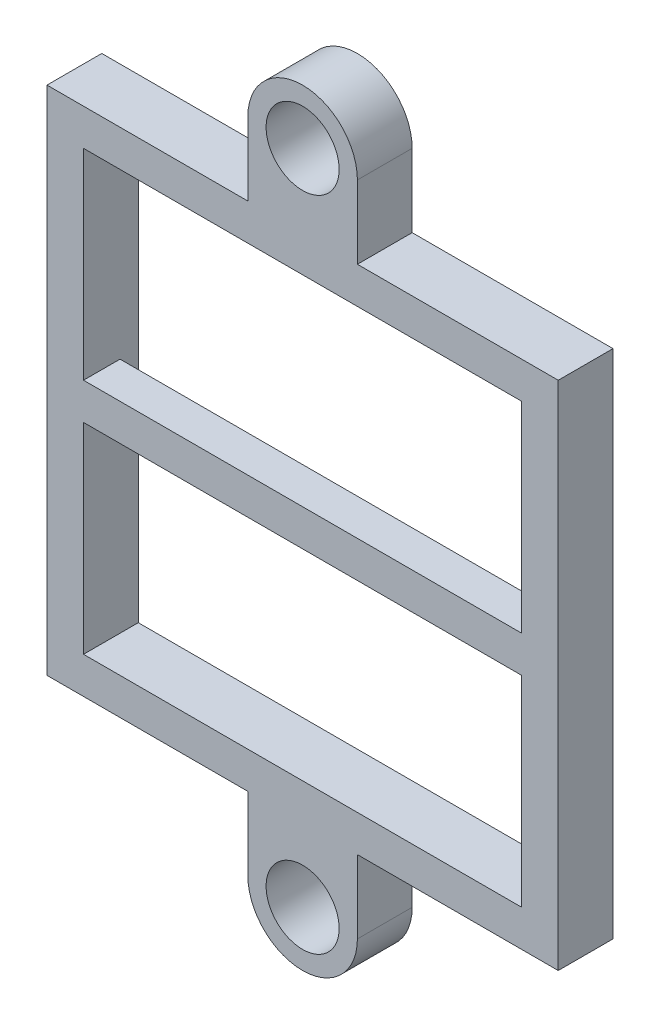
ISO-10303-21;
HEADER;
FILE_DESCRIPTION(('STEP AP214'),'2;1');
FILE_NAME('part.step','',(''),(''),'','','');
FILE_SCHEMA(('AUTOMOTIVE_DESIGN { 1 0 10303 214 1 1 1 1 }'));
ENDSEC;
DATA;
#1=APPLICATION_CONTEXT('core data for automotive mechanical design processes');
#2=APPLICATION_PROTOCOL_DEFINITION('international standard','automotive_design',2000,#1);
#3=PRODUCT_CONTEXT('',#1,'mechanical');
#4=PRODUCT('Part','Part','',(#3));
#5=PRODUCT_RELATED_PRODUCT_CATEGORY('part','',(#4));
#6=PRODUCT_DEFINITION_FORMATION('','',#4);
#7=PRODUCT_DEFINITION_CONTEXT('part definition',#1,'design');
#8=PRODUCT_DEFINITION('design','',#6,#7);
#9=PRODUCT_DEFINITION_SHAPE('','',#8);
#10=(LENGTH_UNIT() NAMED_UNIT(*) SI_UNIT(.MILLI.,.METRE.));
#11=(NAMED_UNIT(*) PLANE_ANGLE_UNIT() SI_UNIT($,.RADIAN.));
#12=(NAMED_UNIT(*) SI_UNIT($,.STERADIAN.) SOLID_ANGLE_UNIT());
#13=UNCERTAINTY_MEASURE_WITH_UNIT(LENGTH_MEASURE(1.E-05),#10,'distance_accuracy_value','');
#14=(GEOMETRIC_REPRESENTATION_CONTEXT(3) GLOBAL_UNCERTAINTY_ASSIGNED_CONTEXT((#13)) GLOBAL_UNIT_ASSIGNED_CONTEXT((#10,
#11,#12)) REPRESENTATION_CONTEXT('',''));
#15=CARTESIAN_POINT('',(0.,0.,0.));
#16=DIRECTION('',(0.,0.,1.));
#17=DIRECTION('',(1.,0.,0.));
#18=AXIS2_PLACEMENT_3D('',#15,#16,#17);
#19=CARTESIAN_POINT('',(-1.5,10.5,0.));
#20=DIRECTION('',(-1.,0.,0.));
#21=DIRECTION('',(0.,0.,1.));
#22=AXIS2_PLACEMENT_3D('',#19,#20,#21);
#23=PLANE('',#22);
#24=DIRECTION('',(0.,-1.,0.));
#25=VECTOR('',#24,1.);
#26=CARTESIAN_POINT('',(-1.5,10.5,1.5));
#27=LINE('',#26,#25);
#28=CARTESIAN_POINT('',(-1.5,9.,1.5));
#29=VERTEX_POINT('',#28);
#30=CARTESIAN_POINT('',(-1.5,7.,1.5));
#31=VERTEX_POINT('',#30);
#32=EDGE_CURVE('E262',#29,#31,#27,.T.);
#33=ORIENTED_EDGE('',*,*,#32,.F.);
#34=DIRECTION('',(0.,0.,1.));
#35=VECTOR('',#34,1.);
#36=CARTESIAN_POINT('',(-1.5,9.,-2.5));
#37=LINE('',#36,#35);
#38=CARTESIAN_POINT('',(-1.5,9.,0.));
#39=VERTEX_POINT('',#38);
#40=EDGE_CURVE('E250',#39,#29,#37,.T.);
#41=ORIENTED_EDGE('',*,*,#40,.F.);
#42=DIRECTION('',(0.,-1.,0.));
#43=VECTOR('',#42,1.);
#44=CARTESIAN_POINT('',(-1.5,10.5,0.));
#45=LINE('',#44,#43);
#46=CARTESIAN_POINT('',(-1.5,7.,0.));
#47=VERTEX_POINT('',#46);
#48=EDGE_CURVE('E264',#39,#47,#45,.T.);
#49=ORIENTED_EDGE('',*,*,#48,.T.);
#50=DIRECTION('',(0.,0.,-1.));
#51=VECTOR('',#50,1.);
#52=CARTESIAN_POINT('',(-1.5,7.,0.));
#53=LINE('',#52,#51);
#54=EDGE_CURVE('E257',#31,#47,#53,.T.);
#55=ORIENTED_EDGE('',*,*,#54,.F.);
#56=EDGE_LOOP('',(#33,#41,#49,#55));
#57=FACE_BOUND('',#56,.T.);
#58=ADVANCED_FACE('F71',(#57),#23,.T.);
#59=CARTESIAN_POINT('',(-7.,7.,1.5));
#60=DIRECTION('',(0.,-1.,0.));
#61=DIRECTION('',(1.,0.,0.));
#62=AXIS2_PLACEMENT_3D('',#59,#60,#61);
#63=PLANE('',#62);
#64=DIRECTION('',(-1.,0.,0.));
#65=VECTOR('',#64,1.);
#66=CARTESIAN_POINT('',(-7.,7.,0.));
#67=LINE('',#66,#65);
#68=CARTESIAN_POINT('',(7.,7.,0.));
#69=VERTEX_POINT('',#68);
#70=CARTESIAN_POINT('',(1.5,7.,0.));
#71=VERTEX_POINT('',#70);
#72=EDGE_CURVE('E326',#69,#71,#67,.T.);
#73=ORIENTED_EDGE('',*,*,#72,.T.);
#74=DIRECTION('',(0.,0.,1.));
#75=VECTOR('',#74,1.);
#76=CARTESIAN_POINT('',(1.5,7.,0.));
#77=LINE('',#76,#75);
#78=CARTESIAN_POINT('',(1.5,7.,1.5));
#79=VERTEX_POINT('',#78);
#80=EDGE_CURVE('E254',#71,#79,#77,.T.);
#81=ORIENTED_EDGE('',*,*,#80,.T.);
#82=DIRECTION('',(-1.,0.,0.));
#83=VECTOR('',#82,1.);
#84=CARTESIAN_POINT('',(-7.,7.,1.5));
#85=LINE('',#84,#83);
#86=CARTESIAN_POINT('',(7.,7.,1.5));
#87=VERTEX_POINT('',#86);
#88=EDGE_CURVE('E333',#87,#79,#85,.T.);
#89=ORIENTED_EDGE('',*,*,#88,.F.);
#90=DIRECTION('',(0.,0.,-1.));
#91=VECTOR('',#90,1.);
#92=CARTESIAN_POINT('',(7.,7.,1.5));
#93=LINE('',#92,#91);
#94=EDGE_CURVE('E350',#87,#69,#93,.T.);
#95=ORIENTED_EDGE('',*,*,#94,.T.);
#96=EDGE_LOOP('',(#73,#81,#89,#95));
#97=FACE_BOUND('',#96,.T.);
#98=ADVANCED_FACE('F405',(#97),#63,.F.);
#99=CARTESIAN_POINT('',(0.,0.,1.5));
#100=DIRECTION('',(0.,0.,-1.));
#101=DIRECTION('',(-1.,0.,0.));
#102=AXIS2_PLACEMENT_3D('',#99,#100,#101);
#103=PLANE('',#102);
#104=DIRECTION('',(0.,1.,0.));
#105=VECTOR('',#104,1.);
#106=CARTESIAN_POINT('',(6.,-6.,1.5));
#107=LINE('',#106,#105);
#108=CARTESIAN_POINT('',(6.,0.5,1.5));
#109=VERTEX_POINT('',#108);
#110=CARTESIAN_POINT('',(6.,6.,1.5));
#111=VERTEX_POINT('',#110);
#112=EDGE_CURVE('E297',#109,#111,#107,.T.);
#113=ORIENTED_EDGE('',*,*,#112,.F.);
#114=DIRECTION('',(-1.,0.,0.));
#115=VECTOR('',#114,1.);
#116=CARTESIAN_POINT('',(6.,0.5,1.5));
#117=LINE('',#116,#115);
#118=CARTESIAN_POINT('',(-6.,0.5,1.5));
#119=VERTEX_POINT('',#118);
#120=EDGE_CURVE('E232',#109,#119,#117,.T.);
#121=ORIENTED_EDGE('',*,*,#120,.T.);
#122=DIRECTION('',(0.,-1.,0.));
#123=VECTOR('',#122,1.);
#124=CARTESIAN_POINT('',(-6.,-6.,1.5));
#125=LINE('',#124,#123);
#126=CARTESIAN_POINT('',(-6.,6.,1.5));
#127=VERTEX_POINT('',#126);
#128=EDGE_CURVE('E218',#127,#119,#125,.T.);
#129=ORIENTED_EDGE('',*,*,#128,.F.);
#130=DIRECTION('',(-1.,0.,0.));
#131=VECTOR('',#130,1.);
#132=CARTESIAN_POINT('',(-6.,6.,1.5));
#133=LINE('',#132,#131);
#134=EDGE_CURVE('E219',#111,#127,#133,.T.);
#135=ORIENTED_EDGE('',*,*,#134,.F.);
#136=EDGE_LOOP('',(#113,#121,#129,#135));
#137=FACE_BOUND('',#136,.T.);
#138=CARTESIAN_POINT('',(0.,9.,1.5));
#139=DIRECTION('',(0.,0.,-1.));
#140=DIRECTION('',(1.,0.,0.));
#141=AXIS2_PLACEMENT_3D('',#138,#139,#140);
#142=CIRCLE('',#141,1.);
#143=CARTESIAN_POINT('',(1.,9.,1.5));
#144=VERTEX_POINT('',#143);
#145=EDGE_CURVE('E242',#144,#144,#142,.T.);
#146=ORIENTED_EDGE('',*,*,#145,.T.);
#147=EDGE_LOOP('',(#146));
#148=FACE_BOUND('',#147,.T.);
#149=CARTESIAN_POINT('',(0.,-9.,1.5));
#150=DIRECTION('',(0.,0.,1.));
#151=DIRECTION('',(1.,0.,0.));
#152=AXIS2_PLACEMENT_3D('',#149,#150,#151);
#153=CIRCLE('',#152,1.);
#154=CARTESIAN_POINT('',(1.,-9.,1.5));
#155=VERTEX_POINT('',#154);
#156=EDGE_CURVE('E268',#155,#155,#153,.T.);
#157=ORIENTED_EDGE('',*,*,#156,.F.);
#158=EDGE_LOOP('',(#157));
#159=FACE_BOUND('',#158,.T.);
#160=CARTESIAN_POINT('',(6.,-6.,1.5));
#161=VERTEX_POINT('',#160);
#162=CARTESIAN_POINT('',(6.,-0.5,1.5));
#163=VERTEX_POINT('',#162);
#164=EDGE_CURVE('E295',#161,#163,#107,.T.);
#165=ORIENTED_EDGE('',*,*,#164,.F.);
#166=DIRECTION('',(1.,0.,0.));
#167=VECTOR('',#166,1.);
#168=CARTESIAN_POINT('',(-6.,-6.,1.5));
#169=LINE('',#168,#167);
#170=CARTESIAN_POINT('',(-6.,-6.,1.5));
#171=VERTEX_POINT('',#170);
#172=EDGE_CURVE('E215',#171,#161,#169,.T.);
#173=ORIENTED_EDGE('',*,*,#172,.F.);
#174=CARTESIAN_POINT('',(-6.,-0.5,1.5));
#175=VERTEX_POINT('',#174);
#176=EDGE_CURVE('E208',#175,#171,#125,.T.);
#177=ORIENTED_EDGE('',*,*,#176,.F.);
#178=DIRECTION('',(1.,0.,0.));
#179=VECTOR('',#178,1.);
#180=CARTESIAN_POINT('',(6.,-0.5,1.5));
#181=LINE('',#180,#179);
#182=EDGE_CURVE('E214',#175,#163,#181,.T.);
#183=ORIENTED_EDGE('',*,*,#182,.T.);
#184=EDGE_LOOP('',(#165,#173,#177,#183));
#185=FACE_BOUND('',#184,.T.);
#186=DIRECTION('',(0.,-1.,0.));
#187=VECTOR('',#186,1.);
#188=CARTESIAN_POINT('',(1.5,10.5,1.5));
#189=LINE('',#188,#187);
#190=CARTESIAN_POINT('',(1.5,9.,1.5));
#191=VERTEX_POINT('',#190);
#192=EDGE_CURVE('E260',#191,#79,#189,.T.);
#193=ORIENTED_EDGE('',*,*,#192,.F.);
#194=CARTESIAN_POINT('',(0.,9.,1.5));
#195=DIRECTION('',(0.,0.,-1.));
#196=DIRECTION('',(1.,0.,0.));
#197=AXIS2_PLACEMENT_3D('',#194,#195,#196);
#198=CIRCLE('',#197,1.5);
#199=EDGE_CURVE('E248',#29,#191,#198,.T.);
#200=ORIENTED_EDGE('',*,*,#199,.F.);
#201=ORIENTED_EDGE('',*,*,#32,.T.);
#202=CARTESIAN_POINT('',(-7.,7.,1.5));
#203=VERTEX_POINT('',#202);
#204=EDGE_CURVE('E332',#31,#203,#85,.T.);
#205=ORIENTED_EDGE('',*,*,#204,.T.);
#206=DIRECTION('',(0.,-1.,0.));
#207=VECTOR('',#206,1.);
#208=CARTESIAN_POINT('',(-7.,-7.,1.5));
#209=LINE('',#208,#207);
#210=CARTESIAN_POINT('',(-7.,-7.,1.5));
#211=VERTEX_POINT('',#210);
#212=EDGE_CURVE('E322',#203,#211,#209,.T.);
#213=ORIENTED_EDGE('',*,*,#212,.T.);
#214=DIRECTION('',(1.,0.,0.));
#215=VECTOR('',#214,1.);
#216=CARTESIAN_POINT('',(-7.,-7.,1.5));
#217=LINE('',#216,#215);
#218=CARTESIAN_POINT('',(-1.5,-7.,1.5));
#219=VERTEX_POINT('',#218);
#220=EDGE_CURVE('E327',#211,#219,#217,.T.);
#221=ORIENTED_EDGE('',*,*,#220,.T.);
#222=DIRECTION('',(0.,1.,0.));
#223=VECTOR('',#222,1.);
#224=CARTESIAN_POINT('',(-1.5,-10.5,1.5));
#225=LINE('',#224,#223);
#226=CARTESIAN_POINT('',(-1.5,-9.,1.5));
#227=VERTEX_POINT('',#226);
#228=EDGE_CURVE('E290',#227,#219,#225,.T.);
#229=ORIENTED_EDGE('',*,*,#228,.F.);
#230=CARTESIAN_POINT('',(0.,-9.,1.5));
#231=DIRECTION('',(0.,0.,1.));
#232=DIRECTION('',(1.,0.,0.));
#233=AXIS2_PLACEMENT_3D('',#230,#231,#232);
#234=CIRCLE('',#233,1.5);
#235=CARTESIAN_POINT('',(1.5,-9.,1.5));
#236=VERTEX_POINT('',#235);
#237=EDGE_CURVE('E272',#227,#236,#234,.T.);
#238=ORIENTED_EDGE('',*,*,#237,.T.);
#239=DIRECTION('',(0.,1.,0.));
#240=VECTOR('',#239,1.);
#241=CARTESIAN_POINT('',(1.5,-10.5,1.5));
#242=LINE('',#241,#240);
#243=CARTESIAN_POINT('',(1.5,-7.,1.5));
#244=VERTEX_POINT('',#243);
#245=EDGE_CURVE('E292',#236,#244,#242,.T.);
#246=ORIENTED_EDGE('',*,*,#245,.T.);
#247=CARTESIAN_POINT('',(7.,-7.,1.5));
#248=VERTEX_POINT('',#247);
#249=EDGE_CURVE('E325',#244,#248,#217,.T.);
#250=ORIENTED_EDGE('',*,*,#249,.T.);
#251=DIRECTION('',(0.,1.,0.));
#252=VECTOR('',#251,1.);
#253=CARTESIAN_POINT('',(7.,-7.,1.5));
#254=LINE('',#253,#252);
#255=EDGE_CURVE('E330',#248,#87,#254,.T.);
#256=ORIENTED_EDGE('',*,*,#255,.T.);
#257=ORIENTED_EDGE('',*,*,#88,.T.);
#258=EDGE_LOOP('',(#193,#200,#201,#205,#213,#221,#229,#238,#246,#250,#256,#257));
#259=FACE_BOUND('',#258,.T.);
#260=ADVANCED_FACE('F211',(#137,#148,#159,#185,#259),#103,.F.);
#261=CARTESIAN_POINT('',(0.,0.,0.));
#262=DIRECTION('',(0.,0.,-1.));
#263=DIRECTION('',(-1.,0.,0.));
#264=AXIS2_PLACEMENT_3D('',#261,#262,#263);
#265=PLANE('',#264);
#266=CARTESIAN_POINT('',(0.,9.,0.));
#267=DIRECTION('',(0.,0.,-1.));
#268=DIRECTION('',(-1.,0.,0.));
#269=AXIS2_PLACEMENT_3D('',#266,#267,#268);
#270=CIRCLE('',#269,1.);
#271=CARTESIAN_POINT('',(-1.,9.,0.));
#272=VERTEX_POINT('',#271);
#273=EDGE_CURVE('E75',#272,#272,#270,.F.);
#274=ORIENTED_EDGE('',*,*,#273,.T.);
#275=EDGE_LOOP('',(#274));
#276=FACE_BOUND('',#275,.T.);
#277=CARTESIAN_POINT('',(0.,9.,0.));
#278=DIRECTION('',(0.,0.,-1.));
#279=DIRECTION('',(-1.,0.,0.));
#280=AXIS2_PLACEMENT_3D('',#277,#278,#279);
#281=CIRCLE('',#280,1.5);
#282=CARTESIAN_POINT('',(1.5,9.,0.));
#283=VERTEX_POINT('',#282);
#284=EDGE_CURVE('E252',#283,#39,#281,.F.);
#285=ORIENTED_EDGE('',*,*,#284,.F.);
#286=DIRECTION('',(0.,-1.,0.));
#287=VECTOR('',#286,1.);
#288=CARTESIAN_POINT('',(1.5,10.5,0.));
#289=LINE('',#288,#287);
#290=EDGE_CURVE('E266',#283,#71,#289,.T.);
#291=ORIENTED_EDGE('',*,*,#290,.T.);
#292=ORIENTED_EDGE('',*,*,#72,.F.);
#293=DIRECTION('',(0.,1.,0.));
#294=VECTOR('',#293,1.);
#295=CARTESIAN_POINT('',(7.,-7.,0.));
#296=LINE('',#295,#294);
#297=CARTESIAN_POINT('',(7.,-7.,0.));
#298=VERTEX_POINT('',#297);
#299=EDGE_CURVE('E343',#298,#69,#296,.T.);
#300=ORIENTED_EDGE('',*,*,#299,.F.);
#301=DIRECTION('',(1.,0.,0.));
#302=VECTOR('',#301,1.);
#303=CARTESIAN_POINT('',(-7.,-7.,0.));
#304=LINE('',#303,#302);
#305=CARTESIAN_POINT('',(1.5,-7.,0.));
#306=VERTEX_POINT('',#305);
#307=EDGE_CURVE('E339',#306,#298,#304,.T.);
#308=ORIENTED_EDGE('',*,*,#307,.F.);
#309=DIRECTION('',(0.,1.,0.));
#310=VECTOR('',#309,1.);
#311=CARTESIAN_POINT('',(1.5,-10.5,0.));
#312=LINE('',#311,#310);
#313=CARTESIAN_POINT('',(1.5,-9.,0.));
#314=VERTEX_POINT('',#313);
#315=EDGE_CURVE('E286',#314,#306,#312,.T.);
#316=ORIENTED_EDGE('',*,*,#315,.F.);
#317=CARTESIAN_POINT('',(0.,-9.,0.));
#318=DIRECTION('',(0.,0.,-1.));
#319=DIRECTION('',(-1.,0.,0.));
#320=AXIS2_PLACEMENT_3D('',#317,#318,#319);
#321=CIRCLE('',#320,1.5);
#322=CARTESIAN_POINT('',(-1.5,-9.,0.));
#323=VERTEX_POINT('',#322);
#324=EDGE_CURVE('E277',#314,#323,#321,.T.);
#325=ORIENTED_EDGE('',*,*,#324,.T.);
#326=DIRECTION('',(0.,1.,0.));
#327=VECTOR('',#326,1.);
#328=CARTESIAN_POINT('',(-1.5,-10.5,0.));
#329=LINE('',#328,#327);
#330=CARTESIAN_POINT('',(-1.5,-7.,0.));
#331=VERTEX_POINT('',#330);
#332=EDGE_CURVE('E288',#323,#331,#329,.T.);
#333=ORIENTED_EDGE('',*,*,#332,.T.);
#334=CARTESIAN_POINT('',(-7.,-7.,0.));
#335=VERTEX_POINT('',#334);
#336=EDGE_CURVE('E340',#335,#331,#304,.T.);
#337=ORIENTED_EDGE('',*,*,#336,.F.);
#338=DIRECTION('',(0.,-1.,0.));
#339=VECTOR('',#338,1.);
#340=CARTESIAN_POINT('',(-7.,-7.,0.));
#341=LINE('',#340,#339);
#342=CARTESIAN_POINT('',(-7.,7.,0.));
#343=VERTEX_POINT('',#342);
#344=EDGE_CURVE('E321',#343,#335,#341,.T.);
#345=ORIENTED_EDGE('',*,*,#344,.F.);
#346=EDGE_CURVE('E345',#47,#343,#67,.T.);
#347=ORIENTED_EDGE('',*,*,#346,.F.);
#348=ORIENTED_EDGE('',*,*,#48,.F.);
#349=EDGE_LOOP('',(#285,#291,#292,#300,#308,#316,#325,#333,#337,#345,#347,#348));
#350=FACE_BOUND('',#349,.T.);
#351=CARTESIAN_POINT('',(0.,-9.,0.));
#352=DIRECTION('',(0.,0.,-1.));
#353=DIRECTION('',(-1.,0.,0.));
#354=AXIS2_PLACEMENT_3D('',#351,#352,#353);
#355=CIRCLE('',#354,1.);
#356=CARTESIAN_POINT('',(-1.,-9.,0.));
#357=VERTEX_POINT('',#356);
#358=EDGE_CURVE('E271',#357,#357,#355,.T.);
#359=ORIENTED_EDGE('',*,*,#358,.F.);
#360=EDGE_LOOP('',(#359));
#361=FACE_BOUND('',#360,.T.);
#362=DIRECTION('',(1.,0.,0.));
#363=VECTOR('',#362,1.);
#364=CARTESIAN_POINT('',(-6.,-6.,0.));
#365=LINE('',#364,#363);
#366=CARTESIAN_POINT('',(-6.,-6.,0.));
#367=VERTEX_POINT('',#366);
#368=CARTESIAN_POINT('',(6.,-6.,0.));
#369=VERTEX_POINT('',#368);
#370=EDGE_CURVE('E309',#367,#369,#365,.T.);
#371=ORIENTED_EDGE('',*,*,#370,.T.);
#372=DIRECTION('',(0.,1.,0.));
#373=VECTOR('',#372,1.);
#374=CARTESIAN_POINT('',(6.,-6.,0.));
#375=LINE('',#374,#373);
#376=CARTESIAN_POINT('',(6.,6.,0.));
#377=VERTEX_POINT('',#376);
#378=EDGE_CURVE('E294',#369,#377,#375,.T.);
#379=ORIENTED_EDGE('',*,*,#378,.T.);
#380=DIRECTION('',(-1.,0.,0.));
#381=VECTOR('',#380,1.);
#382=CARTESIAN_POINT('',(-6.,6.,0.));
#383=LINE('',#382,#381);
#384=CARTESIAN_POINT('',(-6.,6.,0.));
#385=VERTEX_POINT('',#384);
#386=EDGE_CURVE('E303',#377,#385,#383,.T.);
#387=ORIENTED_EDGE('',*,*,#386,.T.);
#388=DIRECTION('',(0.,-1.,0.));
#389=VECTOR('',#388,1.);
#390=CARTESIAN_POINT('',(-6.,-6.,0.));
#391=LINE('',#390,#389);
#392=EDGE_CURVE('E306',#385,#367,#391,.T.);
#393=ORIENTED_EDGE('',*,*,#392,.T.);
#394=EDGE_LOOP('',(#371,#379,#387,#393));
#395=FACE_BOUND('',#394,.T.);
#396=ADVANCED_FACE('F367',(#276,#350,#361,#395),#265,.T.);
#397=CARTESIAN_POINT('',(1.5,-10.5,0.));
#398=DIRECTION('',(-1.,0.,0.));
#399=DIRECTION('',(0.,0.,1.));
#400=AXIS2_PLACEMENT_3D('',#397,#398,#399);
#401=PLANE('',#400);
#402=DIRECTION('',(0.,0.,1.));
#403=VECTOR('',#402,1.);
#404=CARTESIAN_POINT('',(1.5,-9.,-2.5));
#405=LINE('',#404,#403);
#406=EDGE_CURVE('E80',#314,#236,#405,.T.);
#407=ORIENTED_EDGE('',*,*,#406,.F.);
#408=ORIENTED_EDGE('',*,*,#315,.T.);
#409=DIRECTION('',(0.,0.,1.));
#410=VECTOR('',#409,1.);
#411=CARTESIAN_POINT('',(1.5,-7.,0.));
#412=LINE('',#411,#410);
#413=EDGE_CURVE('E280',#306,#244,#412,.T.);
#414=ORIENTED_EDGE('',*,*,#413,.T.);
#415=ORIENTED_EDGE('',*,*,#245,.F.);
#416=EDGE_LOOP('',(#407,#408,#414,#415));
#417=FACE_BOUND('',#416,.T.);
#418=ADVANCED_FACE('F370',(#417),#401,.F.);
#419=CARTESIAN_POINT('',(-7.,-7.,1.5));
#420=DIRECTION('',(0.,1.,0.));
#421=DIRECTION('',(0.,0.,1.));
#422=AXIS2_PLACEMENT_3D('',#419,#420,#421);
#423=PLANE('',#422);
#424=ORIENTED_EDGE('',*,*,#413,.F.);
#425=ORIENTED_EDGE('',*,*,#307,.T.);
#426=DIRECTION('',(0.,0.,-1.));
#427=VECTOR('',#426,1.);
#428=CARTESIAN_POINT('',(7.,-7.,1.5));
#429=LINE('',#428,#427);
#430=EDGE_CURVE('E353',#248,#298,#429,.T.);
#431=ORIENTED_EDGE('',*,*,#430,.F.);
#432=ORIENTED_EDGE('',*,*,#249,.F.);
#433=EDGE_LOOP('',(#424,#425,#431,#432));
#434=FACE_BOUND('',#433,.T.);
#435=ADVANCED_FACE('F435',(#434),#423,.F.);
#436=DIRECTION('',(0.,0.,-1.));
#437=VECTOR('',#436,1.);
#438=CARTESIAN_POINT('',(-1.5,-7.,0.));
#439=LINE('',#438,#437);
#440=EDGE_CURVE('E283',#219,#331,#439,.T.);
#441=ORIENTED_EDGE('',*,*,#440,.F.);
#442=ORIENTED_EDGE('',*,*,#220,.F.);
#443=DIRECTION('',(0.,0.,-1.));
#444=VECTOR('',#443,1.);
#445=CARTESIAN_POINT('',(-7.,-7.,1.5));
#446=LINE('',#445,#444);
#447=EDGE_CURVE('E356',#211,#335,#446,.T.);
#448=ORIENTED_EDGE('',*,*,#447,.T.);
#449=ORIENTED_EDGE('',*,*,#336,.T.);
#450=EDGE_LOOP('',(#441,#442,#448,#449));
#451=FACE_BOUND('',#450,.T.);
#452=ADVANCED_FACE('F453',(#451),#423,.F.);
#453=CARTESIAN_POINT('',(-7.,-7.,1.5));
#454=DIRECTION('',(1.,0.,0.));
#455=DIRECTION('',(0.,0.,-1.));
#456=AXIS2_PLACEMENT_3D('',#453,#454,#455);
#457=PLANE('',#456);
#458=ORIENTED_EDGE('',*,*,#344,.T.);
#459=ORIENTED_EDGE('',*,*,#447,.F.);
#460=ORIENTED_EDGE('',*,*,#212,.F.);
#461=DIRECTION('',(0.,0.,-1.));
#462=VECTOR('',#461,1.);
#463=CARTESIAN_POINT('',(-7.,7.,1.5));
#464=LINE('',#463,#462);
#465=EDGE_CURVE('E336',#203,#343,#464,.T.);
#466=ORIENTED_EDGE('',*,*,#465,.T.);
#467=EDGE_LOOP('',(#458,#459,#460,#466));
#468=FACE_BOUND('',#467,.T.);
#469=ADVANCED_FACE('F73',(#468),#457,.F.);
#470=CARTESIAN_POINT('',(7.,-7.,1.5));
#471=DIRECTION('',(-1.,0.,0.));
#472=DIRECTION('',(0.,-1.,0.));
#473=AXIS2_PLACEMENT_3D('',#470,#471,#472);
#474=PLANE('',#473);
#475=ORIENTED_EDGE('',*,*,#299,.T.);
#476=ORIENTED_EDGE('',*,*,#94,.F.);
#477=ORIENTED_EDGE('',*,*,#255,.F.);
#478=ORIENTED_EDGE('',*,*,#430,.T.);
#479=EDGE_LOOP('',(#475,#476,#477,#478));
#480=FACE_BOUND('',#479,.T.);
#481=ADVANCED_FACE('F448',(#480),#474,.F.);
#482=ORIENTED_EDGE('',*,*,#204,.F.);
#483=ORIENTED_EDGE('',*,*,#54,.T.);
#484=ORIENTED_EDGE('',*,*,#346,.T.);
#485=ORIENTED_EDGE('',*,*,#465,.F.);
#486=EDGE_LOOP('',(#482,#483,#484,#485));
#487=FACE_BOUND('',#486,.T.);
#488=ADVANCED_FACE('F413',(#487),#63,.F.);
#489=CARTESIAN_POINT('',(6.,-6.,1.5));
#490=DIRECTION('',(-1.,0.,0.));
#491=DIRECTION('',(0.,0.,1.));
#492=AXIS2_PLACEMENT_3D('',#489,#490,#491);
#493=PLANE('',#492);
#494=DIRECTION('',(0.,0.,1.));
#495=VECTOR('',#494,1.);
#496=CARTESIAN_POINT('',(6.,0.5,0.5));
#497=LINE('',#496,#495);
#498=CARTESIAN_POINT('',(6.,0.5,0.5));
#499=VERTEX_POINT('',#498);
#500=EDGE_CURVE('E243',#499,#109,#497,.T.);
#501=ORIENTED_EDGE('',*,*,#500,.T.);
#502=ORIENTED_EDGE('',*,*,#112,.T.);
#503=DIRECTION('',(0.,0.,-1.));
#504=VECTOR('',#503,1.);
#505=CARTESIAN_POINT('',(6.,6.,1.5));
#506=LINE('',#505,#504);
#507=EDGE_CURVE('E318',#111,#377,#506,.T.);
#508=ORIENTED_EDGE('',*,*,#507,.T.);
#509=ORIENTED_EDGE('',*,*,#378,.F.);
#510=DIRECTION('',(0.,0.,-1.));
#511=VECTOR('',#510,1.);
#512=CARTESIAN_POINT('',(6.,-6.,1.5));
#513=LINE('',#512,#511);
#514=EDGE_CURVE('E300',#161,#369,#513,.T.);
#515=ORIENTED_EDGE('',*,*,#514,.F.);
#516=ORIENTED_EDGE('',*,*,#164,.T.);
#517=DIRECTION('',(0.,0.,1.));
#518=VECTOR('',#517,1.);
#519=CARTESIAN_POINT('',(6.,-0.5,0.5));
#520=LINE('',#519,#518);
#521=CARTESIAN_POINT('',(6.,-0.5,0.5));
#522=VERTEX_POINT('',#521);
#523=EDGE_CURVE('E92',#522,#163,#520,.T.);
#524=ORIENTED_EDGE('',*,*,#523,.F.);
#525=DIRECTION('',(0.,1.,0.));
#526=VECTOR('',#525,1.);
#527=CARTESIAN_POINT('',(6.,-0.5,0.5));
#528=LINE('',#527,#526);
#529=EDGE_CURVE('E87',#522,#499,#528,.T.);
#530=ORIENTED_EDGE('',*,*,#529,.T.);
#531=EDGE_LOOP('',(#501,#502,#508,#509,#515,#516,#524,#530));
#532=FACE_BOUND('',#531,.T.);
#533=ADVANCED_FACE('F378',(#532),#493,.T.);
#534=CARTESIAN_POINT('',(-6.,6.,1.5));
#535=DIRECTION('',(0.,-1.,0.));
#536=DIRECTION('',(0.,0.,-1.));
#537=AXIS2_PLACEMENT_3D('',#534,#535,#536);
#538=PLANE('',#537);
#539=ORIENTED_EDGE('',*,*,#386,.F.);
#540=ORIENTED_EDGE('',*,*,#507,.F.);
#541=ORIENTED_EDGE('',*,*,#134,.T.);
#542=DIRECTION('',(0.,0.,-1.));
#543=VECTOR('',#542,1.);
#544=CARTESIAN_POINT('',(-6.,6.,1.5));
#545=LINE('',#544,#543);
#546=EDGE_CURVE('E316',#127,#385,#545,.T.);
#547=ORIENTED_EDGE('',*,*,#546,.T.);
#548=EDGE_LOOP('',(#539,#540,#541,#547));
#549=FACE_BOUND('',#548,.T.);
#550=ADVANCED_FACE('F382',(#549),#538,.T.);
#551=CARTESIAN_POINT('',(-6.,-6.,1.5));
#552=DIRECTION('',(1.,0.,0.));
#553=DIRECTION('',(0.,0.,-1.));
#554=AXIS2_PLACEMENT_3D('',#551,#552,#553);
#555=PLANE('',#554);
#556=DIRECTION('',(0.,0.,1.));
#557=VECTOR('',#556,1.);
#558=CARTESIAN_POINT('',(-6.,0.5,0.5));
#559=LINE('',#558,#557);
#560=CARTESIAN_POINT('',(-6.,0.5,0.5));
#561=VERTEX_POINT('',#560);
#562=EDGE_CURVE('E239',#561,#119,#559,.T.);
#563=ORIENTED_EDGE('',*,*,#562,.F.);
#564=DIRECTION('',(0.,-1.,0.));
#565=VECTOR('',#564,1.);
#566=CARTESIAN_POINT('',(-6.,-0.5,0.5));
#567=LINE('',#566,#565);
#568=CARTESIAN_POINT('',(-6.,-0.5,0.5));
#569=VERTEX_POINT('',#568);
#570=EDGE_CURVE('E225',#561,#569,#567,.T.);
#571=ORIENTED_EDGE('',*,*,#570,.T.);
#572=DIRECTION('',(0.,0.,1.));
#573=VECTOR('',#572,1.);
#574=CARTESIAN_POINT('',(-6.,-0.5,0.5));
#575=LINE('',#574,#573);
#576=EDGE_CURVE('E222',#569,#175,#575,.T.);
#577=ORIENTED_EDGE('',*,*,#576,.T.);
#578=ORIENTED_EDGE('',*,*,#176,.T.);
#579=DIRECTION('',(0.,0.,-1.));
#580=VECTOR('',#579,1.);
#581=CARTESIAN_POINT('',(-6.,-6.,1.5));
#582=LINE('',#581,#580);
#583=EDGE_CURVE('E314',#171,#367,#582,.T.);
#584=ORIENTED_EDGE('',*,*,#583,.T.);
#585=ORIENTED_EDGE('',*,*,#392,.F.);
#586=ORIENTED_EDGE('',*,*,#546,.F.);
#587=ORIENTED_EDGE('',*,*,#128,.T.);
#588=EDGE_LOOP('',(#563,#571,#577,#578,#584,#585,#586,#587));
#589=FACE_BOUND('',#588,.T.);
#590=ADVANCED_FACE('F223',(#589),#555,.T.);
#591=CARTESIAN_POINT('',(-6.,-6.,1.5));
#592=DIRECTION('',(0.,1.,0.));
#593=DIRECTION('',(0.,0.,1.));
#594=AXIS2_PLACEMENT_3D('',#591,#592,#593);
#595=PLANE('',#594);
#596=ORIENTED_EDGE('',*,*,#370,.F.);
#597=ORIENTED_EDGE('',*,*,#583,.F.);
#598=ORIENTED_EDGE('',*,*,#172,.T.);
#599=ORIENTED_EDGE('',*,*,#514,.T.);
#600=EDGE_LOOP('',(#596,#597,#598,#599));
#601=FACE_BOUND('',#600,.T.);
#602=ADVANCED_FACE('F376',(#601),#595,.T.);
#603=CARTESIAN_POINT('',(-1.5,-10.5,0.));
#604=DIRECTION('',(1.,0.,0.));
#605=DIRECTION('',(0.,0.,-1.));
#606=AXIS2_PLACEMENT_3D('',#603,#604,#605);
#607=PLANE('',#606);
#608=ORIENTED_EDGE('',*,*,#332,.F.);
#609=DIRECTION('',(0.,0.,1.));
#610=VECTOR('',#609,1.);
#611=CARTESIAN_POINT('',(-1.5,-9.,-2.5));
#612=LINE('',#611,#610);
#613=EDGE_CURVE('E274',#323,#227,#612,.T.);
#614=ORIENTED_EDGE('',*,*,#613,.T.);
#615=ORIENTED_EDGE('',*,*,#228,.T.);
#616=ORIENTED_EDGE('',*,*,#440,.T.);
#617=EDGE_LOOP('',(#608,#614,#615,#616));
#618=FACE_BOUND('',#617,.T.);
#619=ADVANCED_FACE('F428',(#618),#607,.F.);
#620=CARTESIAN_POINT('',(0.,-9.,-2.5));
#621=DIRECTION('',(0.,0.,1.));
#622=DIRECTION('',(1.,0.,0.));
#623=AXIS2_PLACEMENT_3D('',#620,#621,#622);
#624=CYLINDRICAL_SURFACE('',#623,1.5);
#625=ORIENTED_EDGE('',*,*,#324,.F.);
#626=ORIENTED_EDGE('',*,*,#406,.T.);
#627=ORIENTED_EDGE('',*,*,#237,.F.);
#628=ORIENTED_EDGE('',*,*,#613,.F.);
#629=EDGE_LOOP('',(#625,#626,#627,#628));
#630=FACE_BOUND('',#629,.T.);
#631=ADVANCED_FACE('F425',(#630),#624,.T.);
#632=CARTESIAN_POINT('',(0.,-9.,-2.5));
#633=DIRECTION('',(0.,0.,1.));
#634=DIRECTION('',(1.,0.,0.));
#635=AXIS2_PLACEMENT_3D('',#632,#633,#634);
#636=CYLINDRICAL_SURFACE('',#635,1.);
#637=ORIENTED_EDGE('',*,*,#358,.T.);
#638=EDGE_LOOP('',(#637));
#639=FACE_BOUND('',#638,.T.);
#640=ORIENTED_EDGE('',*,*,#156,.T.);
#641=EDGE_LOOP('',(#640));
#642=FACE_BOUND('',#641,.T.);
#643=ADVANCED_FACE('F364',(#639,#642),#636,.F.);
#644=CARTESIAN_POINT('',(1.5,10.5,0.));
#645=DIRECTION('',(1.,0.,0.));
#646=DIRECTION('',(0.,0.,-1.));
#647=AXIS2_PLACEMENT_3D('',#644,#645,#646);
#648=PLANE('',#647);
#649=DIRECTION('',(0.,0.,1.));
#650=VECTOR('',#649,1.);
#651=CARTESIAN_POINT('',(1.5,9.,-2.5));
#652=LINE('',#651,#650);
#653=EDGE_CURVE('E12',#191,#283,#652,.F.);
#654=ORIENTED_EDGE('',*,*,#653,.F.);
#655=ORIENTED_EDGE('',*,*,#192,.T.);
#656=ORIENTED_EDGE('',*,*,#80,.F.);
#657=ORIENTED_EDGE('',*,*,#290,.F.);
#658=EDGE_LOOP('',(#654,#655,#656,#657));
#659=FACE_BOUND('',#658,.T.);
#660=ADVANCED_FACE('F419',(#659),#648,.T.);
#661=CARTESIAN_POINT('',(0.,9.,-2.5));
#662=DIRECTION('',(0.,0.,1.));
#663=DIRECTION('',(1.,0.,0.));
#664=AXIS2_PLACEMENT_3D('',#661,#662,#663);
#665=CYLINDRICAL_SURFACE('',#664,1.5);
#666=ORIENTED_EDGE('',*,*,#284,.T.);
#667=ORIENTED_EDGE('',*,*,#40,.T.);
#668=ORIENTED_EDGE('',*,*,#199,.T.);
#669=ORIENTED_EDGE('',*,*,#653,.T.);
#670=EDGE_LOOP('',(#666,#667,#668,#669));
#671=FACE_BOUND('',#670,.T.);
#672=ADVANCED_FACE('F417',(#671),#665,.T.);
#673=CARTESIAN_POINT('',(0.,9.,-2.5));
#674=DIRECTION('',(0.,0.,1.));
#675=DIRECTION('',(1.,0.,0.));
#676=AXIS2_PLACEMENT_3D('',#673,#674,#675);
#677=CYLINDRICAL_SURFACE('',#676,1.);
#678=ORIENTED_EDGE('',*,*,#273,.F.);
#679=EDGE_LOOP('',(#678));
#680=FACE_BOUND('',#679,.T.);
#681=ORIENTED_EDGE('',*,*,#145,.F.);
#682=EDGE_LOOP('',(#681));
#683=FACE_BOUND('',#682,.T.);
#684=ADVANCED_FACE('F492',(#680,#683),#677,.F.);
#685=CARTESIAN_POINT('',(6.,0.5,0.5));
#686=DIRECTION('',(0.,1.,0.));
#687=DIRECTION('',(0.,0.,1.));
#688=AXIS2_PLACEMENT_3D('',#685,#686,#687);
#689=PLANE('',#688);
#690=ORIENTED_EDGE('',*,*,#120,.F.);
#691=ORIENTED_EDGE('',*,*,#500,.F.);
#692=DIRECTION('',(-1.,0.,0.));
#693=VECTOR('',#692,1.);
#694=CARTESIAN_POINT('',(6.,0.5,0.5));
#695=LINE('',#694,#693);
#696=EDGE_CURVE('E229',#499,#561,#695,.T.);
#697=ORIENTED_EDGE('',*,*,#696,.T.);
#698=ORIENTED_EDGE('',*,*,#562,.T.);
#699=EDGE_LOOP('',(#690,#691,#697,#698));
#700=FACE_BOUND('',#699,.T.);
#701=ADVANCED_FACE('F390',(#700),#689,.T.);
#702=CARTESIAN_POINT('',(6.,-0.5,0.5));
#703=DIRECTION('',(0.,-1.,0.));
#704=DIRECTION('',(0.,0.,-1.));
#705=AXIS2_PLACEMENT_3D('',#702,#703,#704);
#706=PLANE('',#705);
#707=ORIENTED_EDGE('',*,*,#182,.F.);
#708=ORIENTED_EDGE('',*,*,#576,.F.);
#709=DIRECTION('',(1.,0.,0.));
#710=VECTOR('',#709,1.);
#711=CARTESIAN_POINT('',(6.,-0.5,0.5));
#712=LINE('',#711,#710);
#713=EDGE_CURVE('E393',#569,#522,#712,.T.);
#714=ORIENTED_EDGE('',*,*,#713,.T.);
#715=ORIENTED_EDGE('',*,*,#523,.T.);
#716=EDGE_LOOP('',(#707,#708,#714,#715));
#717=FACE_BOUND('',#716,.T.);
#718=ADVANCED_FACE('F231',(#717),#706,.T.);
#719=CARTESIAN_POINT('',(0.,0.,0.5));
#720=DIRECTION('',(0.,0.,1.));
#721=DIRECTION('',(1.,0.,0.));
#722=AXIS2_PLACEMENT_3D('',#719,#720,#721);
#723=PLANE('',#722);
#724=ORIENTED_EDGE('',*,*,#570,.F.);
#725=ORIENTED_EDGE('',*,*,#696,.F.);
#726=ORIENTED_EDGE('',*,*,#529,.F.);
#727=ORIENTED_EDGE('',*,*,#713,.F.);
#728=EDGE_LOOP('',(#724,#725,#726,#727));
#729=FACE_BOUND('',#728,.T.);
#730=ADVANCED_FACE('F396',(#729),#723,.F.);
#731=CLOSED_SHELL('',(#58,#98,#260,#396,#418,#435,#452,#469,#481,#488,#533,#550,#590,#602,#619,
#631,#643,#660,#672,#684,#701,#718,#730));
#732=MANIFOLD_SOLID_BREP('B2',#731);
#733=ADVANCED_BREP_SHAPE_REPRESENTATION('',(#18,#732),#14);
#734=SHAPE_DEFINITION_REPRESENTATION(#9,#733);
ENDSEC;
END-ISO-10303-21;
